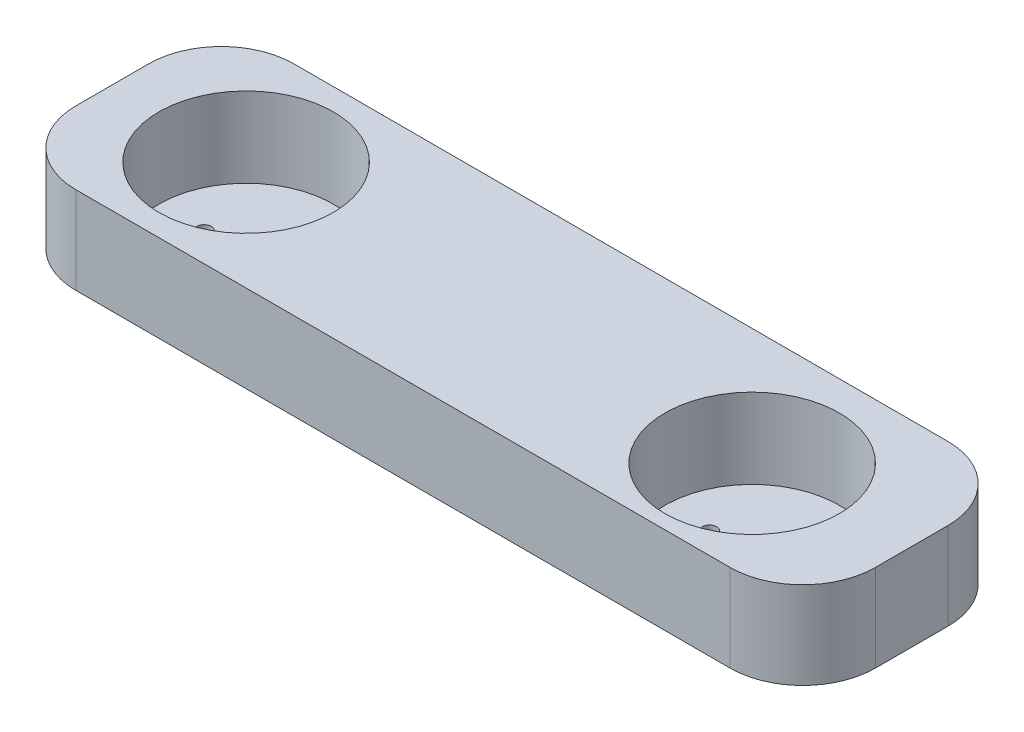
ISO-10303-21;
HEADER;
FILE_DESCRIPTION(('STEP AP214'),'2;1');
FILE_NAME('part.step','',(''),(''),'','','');
FILE_SCHEMA(('AUTOMOTIVE_DESIGN { 1 0 10303 214 1 1 1 1 }'));
ENDSEC;
DATA;
#1=APPLICATION_CONTEXT('core data for automotive mechanical design processes');
#2=APPLICATION_PROTOCOL_DEFINITION('international standard','automotive_design',2000,#1);
#3=PRODUCT_CONTEXT('',#1,'mechanical');
#4=PRODUCT('Part','Part','',(#3));
#5=PRODUCT_RELATED_PRODUCT_CATEGORY('part','',(#4));
#6=PRODUCT_DEFINITION_FORMATION('','',#4);
#7=PRODUCT_DEFINITION_CONTEXT('part definition',#1,'design');
#8=PRODUCT_DEFINITION('design','',#6,#7);
#9=PRODUCT_DEFINITION_SHAPE('','',#8);
#10=(LENGTH_UNIT() NAMED_UNIT(*) SI_UNIT(.MILLI.,.METRE.));
#11=(NAMED_UNIT(*) PLANE_ANGLE_UNIT() SI_UNIT($,.RADIAN.));
#12=(NAMED_UNIT(*) SI_UNIT($,.STERADIAN.) SOLID_ANGLE_UNIT());
#13=UNCERTAINTY_MEASURE_WITH_UNIT(LENGTH_MEASURE(1.E-05),#10,'distance_accuracy_value','');
#14=(GEOMETRIC_REPRESENTATION_CONTEXT(3) GLOBAL_UNCERTAINTY_ASSIGNED_CONTEXT((#13)) GLOBAL_UNIT_ASSIGNED_CONTEXT((#10,
#11,#12)) REPRESENTATION_CONTEXT('',''));
#15=CARTESIAN_POINT('',(0.,0.,0.));
#16=DIRECTION('',(0.,0.,1.));
#17=DIRECTION('',(1.,0.,0.));
#18=AXIS2_PLACEMENT_3D('',#15,#16,#17);
#19=CARTESIAN_POINT('',(-49.6145692439427,12.,-18.5383745295534));
#20=DIRECTION('',(1.,0.,0.));
#21=DIRECTION('',(0.,0.,-1.));
#22=AXIS2_PLACEMENT_3D('',#19,#20,#21);
#23=PLANE('',#22);
#24=DIRECTION('',(0.,0.,1.));
#25=VECTOR('',#24,1.);
#26=CARTESIAN_POINT('',(-49.6145692439427,12.,-18.5383745295534));
#27=LINE('',#26,#25);
#28=CARTESIAN_POINT('',(-49.6145692439427,12.,-8.53837452955342));
#29=VERTEX_POINT('',#28);
#30=CARTESIAN_POINT('',(-49.6145692439427,12.,1.46162547044658));
#31=VERTEX_POINT('',#30);
#32=EDGE_CURVE('E119',#29,#31,#27,.T.);
#33=ORIENTED_EDGE('',*,*,#32,.F.);
#34=DIRECTION('',(0.,-1.,0.));
#35=VECTOR('',#34,1.);
#36=CARTESIAN_POINT('',(-49.6145692439427,12.,-8.53837452955342));
#37=LINE('',#36,#35);
#38=CARTESIAN_POINT('',(-49.6145692439427,0.,-8.53837452955342));
#39=VERTEX_POINT('',#38);
#40=EDGE_CURVE('E105',#29,#39,#37,.T.);
#41=ORIENTED_EDGE('',*,*,#40,.T.);
#42=DIRECTION('',(0.,0.,1.));
#43=VECTOR('',#42,1.);
#44=CARTESIAN_POINT('',(-49.6145692439427,0.,-18.5383745295534));
#45=LINE('',#44,#43);
#46=CARTESIAN_POINT('',(-49.6145692439427,0.,1.46162547044658));
#47=VERTEX_POINT('',#46);
#48=EDGE_CURVE('E116',#39,#47,#45,.T.);
#49=ORIENTED_EDGE('',*,*,#48,.T.);
#50=DIRECTION('',(0.,-1.,0.));
#51=VECTOR('',#50,1.);
#52=CARTESIAN_POINT('',(-49.6145692439427,12.,1.46162547044658));
#53=LINE('',#52,#51);
#54=EDGE_CURVE('E120',#47,#31,#53,.F.);
#55=ORIENTED_EDGE('',*,*,#54,.T.);
#56=EDGE_LOOP('',(#33,#41,#49,#55));
#57=FACE_BOUND('',#56,.T.);
#58=ADVANCED_FACE('F33',(#57),#23,.F.);
#59=CARTESIAN_POINT('',(-49.6145692439427,12.,11.4616254704466));
#60=DIRECTION('',(0.,0.,-1.));
#61=DIRECTION('',(-1.,0.,0.));
#62=AXIS2_PLACEMENT_3D('',#59,#60,#61);
#63=PLANE('',#62);
#64=DIRECTION('',(1.,0.,0.));
#65=VECTOR('',#64,1.);
#66=CARTESIAN_POINT('',(-49.6145692439427,0.,11.4616254704466));
#67=LINE('',#66,#65);
#68=CARTESIAN_POINT('',(-39.6145692439427,0.,11.4616254704466));
#69=VERTEX_POINT('',#68);
#70=CARTESIAN_POINT('',(50.3854307560573,0.,11.4616254704466));
#71=VERTEX_POINT('',#70);
#72=EDGE_CURVE('E124',#69,#71,#67,.T.);
#73=ORIENTED_EDGE('',*,*,#72,.T.);
#74=DIRECTION('',(0.,-1.,0.));
#75=VECTOR('',#74,1.);
#76=CARTESIAN_POINT('',(50.3854307560573,12.,11.4616254704466));
#77=LINE('',#76,#75);
#78=CARTESIAN_POINT('',(50.3854307560573,12.,11.4616254704466));
#79=VERTEX_POINT('',#78);
#80=EDGE_CURVE('E11',#71,#79,#77,.F.);
#81=ORIENTED_EDGE('',*,*,#80,.T.);
#82=DIRECTION('',(1.,0.,0.));
#83=VECTOR('',#82,1.);
#84=CARTESIAN_POINT('',(-49.6145692439427,12.,11.4616254704466));
#85=LINE('',#84,#83);
#86=CARTESIAN_POINT('',(-39.6145692439427,12.,11.4616254704466));
#87=VERTEX_POINT('',#86);
#88=EDGE_CURVE('E178',#87,#79,#85,.T.);
#89=ORIENTED_EDGE('',*,*,#88,.F.);
#90=DIRECTION('',(0.,-1.,0.));
#91=VECTOR('',#90,1.);
#92=CARTESIAN_POINT('',(-39.6145692439427,12.,11.4616254704466));
#93=LINE('',#92,#91);
#94=EDGE_CURVE('E146',#87,#69,#93,.T.);
#95=ORIENTED_EDGE('',*,*,#94,.T.);
#96=EDGE_LOOP('',(#73,#81,#89,#95));
#97=FACE_BOUND('',#96,.T.);
#98=ADVANCED_FACE('F176',(#97),#63,.F.);
#99=CARTESIAN_POINT('',(60.3854307560573,12.,-18.5383745295534));
#100=DIRECTION('',(-1.,0.,0.));
#101=DIRECTION('',(0.,0.,1.));
#102=AXIS2_PLACEMENT_3D('',#99,#100,#101);
#103=PLANE('',#102);
#104=DIRECTION('',(0.,0.,-1.));
#105=VECTOR('',#104,1.);
#106=CARTESIAN_POINT('',(60.3854307560573,0.,-18.5383745295534));
#107=LINE('',#106,#105);
#108=CARTESIAN_POINT('',(60.3854307560573,0.,1.46162547044659));
#109=VERTEX_POINT('',#108);
#110=CARTESIAN_POINT('',(60.3854307560573,0.,-8.53837452955341));
#111=VERTEX_POINT('',#110);
#112=EDGE_CURVE('E127',#109,#111,#107,.T.);
#113=ORIENTED_EDGE('',*,*,#112,.T.);
#114=DIRECTION('',(0.,-1.,0.));
#115=VECTOR('',#114,1.);
#116=CARTESIAN_POINT('',(60.3854307560573,12.,-8.53837452955341));
#117=LINE('',#116,#115);
#118=CARTESIAN_POINT('',(60.3854307560573,12.,-8.53837452955341));
#119=VERTEX_POINT('',#118);
#120=EDGE_CURVE('E54',#111,#119,#117,.F.);
#121=ORIENTED_EDGE('',*,*,#120,.T.);
#122=DIRECTION('',(0.,0.,-1.));
#123=VECTOR('',#122,1.);
#124=CARTESIAN_POINT('',(60.3854307560573,12.,-18.5383745295534));
#125=LINE('',#124,#123);
#126=CARTESIAN_POINT('',(60.3854307560573,12.,1.46162547044659));
#127=VERTEX_POINT('',#126);
#128=EDGE_CURVE('E165',#127,#119,#125,.T.);
#129=ORIENTED_EDGE('',*,*,#128,.F.);
#130=DIRECTION('',(0.,-1.,0.));
#131=VECTOR('',#130,1.);
#132=CARTESIAN_POINT('',(60.3854307560573,12.,1.46162547044659));
#133=LINE('',#132,#131);
#134=EDGE_CURVE('E156',#127,#109,#133,.T.);
#135=ORIENTED_EDGE('',*,*,#134,.T.);
#136=EDGE_LOOP('',(#113,#121,#129,#135));
#137=FACE_BOUND('',#136,.T.);
#138=ADVANCED_FACE('F172',(#137),#103,.F.);
#139=CARTESIAN_POINT('',(-49.6145692439427,12.,-18.5383745295534));
#140=DIRECTION('',(0.,0.,1.));
#141=DIRECTION('',(1.,0.,0.));
#142=AXIS2_PLACEMENT_3D('',#139,#140,#141);
#143=PLANE('',#142);
#144=DIRECTION('',(-1.,0.,0.));
#145=VECTOR('',#144,1.);
#146=CARTESIAN_POINT('',(-49.6145692439427,12.,-18.5383745295534));
#147=LINE('',#146,#145);
#148=CARTESIAN_POINT('',(50.3854307560573,12.,-18.5383745295534));
#149=VERTEX_POINT('',#148);
#150=CARTESIAN_POINT('',(-39.6145692439427,12.,-18.5383745295534));
#151=VERTEX_POINT('',#150);
#152=EDGE_CURVE('E133',#149,#151,#147,.T.);
#153=ORIENTED_EDGE('',*,*,#152,.F.);
#154=DIRECTION('',(0.,-1.,0.));
#155=VECTOR('',#154,1.);
#156=CARTESIAN_POINT('',(50.3854307560573,12.,-18.5383745295534));
#157=LINE('',#156,#155);
#158=CARTESIAN_POINT('',(50.3854307560573,0.,-18.5383745295534));
#159=VERTEX_POINT('',#158);
#160=EDGE_CURVE('E149',#149,#159,#157,.T.);
#161=ORIENTED_EDGE('',*,*,#160,.T.);
#162=DIRECTION('',(-1.,0.,0.));
#163=VECTOR('',#162,1.);
#164=CARTESIAN_POINT('',(-49.6145692439427,0.,-18.5383745295534));
#165=LINE('',#164,#163);
#166=CARTESIAN_POINT('',(-39.6145692439427,0.,-18.5383745295534));
#167=VERTEX_POINT('',#166);
#168=EDGE_CURVE('E137',#159,#167,#165,.T.);
#169=ORIENTED_EDGE('',*,*,#168,.T.);
#170=DIRECTION('',(0.,-1.,0.));
#171=VECTOR('',#170,1.);
#172=CARTESIAN_POINT('',(-39.6145692439427,12.,-18.5383745295534));
#173=LINE('',#172,#171);
#174=EDGE_CURVE('E107',#167,#151,#173,.F.);
#175=ORIENTED_EDGE('',*,*,#174,.T.);
#176=EDGE_LOOP('',(#153,#161,#169,#175));
#177=FACE_BOUND('',#176,.T.);
#178=ADVANCED_FACE('F169',(#177),#143,.F.);
#179=CARTESIAN_POINT('',(0.,12.,0.));
#180=DIRECTION('',(0.,1.,0.));
#181=DIRECTION('',(0.,0.,1.));
#182=AXIS2_PLACEMENT_3D('',#179,#180,#181);
#183=PLANE('',#182);
#184=CARTESIAN_POINT('',(39.5010706753496,12.,-2.46616460756854));
#185=DIRECTION('',(0.,1.,0.));
#186=DIRECTION('',(0.,0.,1.));
#187=AXIS2_PLACEMENT_3D('',#184,#185,#186);
#188=CIRCLE('',#187,12.);
#189=CARTESIAN_POINT('',(39.5010706753496,12.,9.53383539243146));
#190=VERTEX_POINT('',#189);
#191=EDGE_CURVE('E188',#190,#190,#188,.T.);
#192=ORIENTED_EDGE('',*,*,#191,.F.);
#193=EDGE_LOOP('',(#192));
#194=FACE_BOUND('',#193,.T.);
#195=CARTESIAN_POINT('',(-31.1957624230947,12.,-3.53837452955342));
#196=DIRECTION('',(0.,1.,0.));
#197=DIRECTION('',(0.,0.,1.));
#198=AXIS2_PLACEMENT_3D('',#195,#196,#197);
#199=CIRCLE('',#198,12.);
#200=CARTESIAN_POINT('',(-31.1957624230947,12.,8.46162547044659));
#201=VERTEX_POINT('',#200);
#202=EDGE_CURVE('E130',#201,#201,#199,.T.);
#203=ORIENTED_EDGE('',*,*,#202,.F.);
#204=EDGE_LOOP('',(#203));
#205=FACE_BOUND('',#204,.T.);
#206=ORIENTED_EDGE('',*,*,#128,.T.);
#207=CARTESIAN_POINT('',(50.3854307560573,12.,-8.53837452955342));
#208=DIRECTION('',(0.,1.,0.));
#209=DIRECTION('',(0.,0.,1.));
#210=AXIS2_PLACEMENT_3D('',#207,#208,#209);
#211=CIRCLE('',#210,10.);
#212=EDGE_CURVE('E41',#119,#149,#211,.T.);
#213=ORIENTED_EDGE('',*,*,#212,.T.);
#214=ORIENTED_EDGE('',*,*,#152,.T.);
#215=CARTESIAN_POINT('',(-39.6145692439427,12.,-8.53837452955342));
#216=DIRECTION('',(0.,1.,0.));
#217=DIRECTION('',(0.,0.,1.));
#218=AXIS2_PLACEMENT_3D('',#215,#216,#217);
#219=CIRCLE('',#218,10.);
#220=EDGE_CURVE('E144',#151,#29,#219,.T.);
#221=ORIENTED_EDGE('',*,*,#220,.T.);
#222=ORIENTED_EDGE('',*,*,#32,.T.);
#223=CARTESIAN_POINT('',(-39.6145692439427,12.,1.46162547044658));
#224=DIRECTION('',(0.,1.,0.));
#225=DIRECTION('',(0.,0.,1.));
#226=AXIS2_PLACEMENT_3D('',#223,#224,#225);
#227=CIRCLE('',#226,10.);
#228=EDGE_CURVE('E142',#31,#87,#227,.T.);
#229=ORIENTED_EDGE('',*,*,#228,.T.);
#230=ORIENTED_EDGE('',*,*,#88,.T.);
#231=CARTESIAN_POINT('',(50.3854307560573,12.,1.46162547044659));
#232=DIRECTION('',(0.,1.,0.));
#233=DIRECTION('',(0.,0.,1.));
#234=AXIS2_PLACEMENT_3D('',#231,#232,#233);
#235=CIRCLE('',#234,10.);
#236=EDGE_CURVE('E160',#79,#127,#235,.T.);
#237=ORIENTED_EDGE('',*,*,#236,.T.);
#238=EDGE_LOOP('',(#206,#213,#214,#221,#222,#229,#230,#237));
#239=FACE_BOUND('',#238,.T.);
#240=ADVANCED_FACE('F164',(#194,#205,#239),#183,.T.);
#241=CARTESIAN_POINT('',(0.,0.,0.));
#242=DIRECTION('',(0.,1.,0.));
#243=DIRECTION('',(0.,0.,1.));
#244=AXIS2_PLACEMENT_3D('',#241,#242,#243);
#245=PLANE('',#244);
#246=CARTESIAN_POINT('',(-36.9327614376234,0.,-3.48451722341676));
#247=DIRECTION('',(0.,1.,0.));
#248=DIRECTION('',(0.,0.,-1.));
#249=AXIS2_PLACEMENT_3D('',#246,#247,#248);
#250=CIRCLE('',#249,0.999999999999998);
#251=CARTESIAN_POINT('',(-36.9327614376234,0.,-4.48451722341675));
#252=VERTEX_POINT('',#251);
#253=EDGE_CURVE('E221',#252,#252,#250,.T.);
#254=ORIENTED_EDGE('',*,*,#253,.T.);
#255=EDGE_LOOP('',(#254));
#256=FACE_BOUND('',#255,.T.);
#257=CARTESIAN_POINT('',(-25.0727614376234,0.,-3.48451722341676));
#258=DIRECTION('',(0.,1.,0.));
#259=DIRECTION('',(0.,0.,1.));
#260=AXIS2_PLACEMENT_3D('',#257,#258,#259);
#261=CIRCLE('',#260,0.999999999999998);
#262=CARTESIAN_POINT('',(-25.0727614376234,0.,-2.48451722341676));
#263=VERTEX_POINT('',#262);
#264=EDGE_CURVE('E215',#263,#263,#261,.T.);
#265=ORIENTED_EDGE('',*,*,#264,.T.);
#266=EDGE_LOOP('',(#265));
#267=FACE_BOUND('',#266,.T.);
#268=CARTESIAN_POINT('',(-31.0027614376234,0.,-3.48451722341676));
#269=DIRECTION('',(0.,1.,0.));
#270=DIRECTION('',(0.,0.,1.));
#271=AXIS2_PLACEMENT_3D('',#268,#269,#270);
#272=CIRCLE('',#271,3.43);
#273=CARTESIAN_POINT('',(-31.0027614376234,0.,-0.0545172234167543));
#274=VERTEX_POINT('',#273);
#275=EDGE_CURVE('E204',#274,#274,#272,.T.);
#276=ORIENTED_EDGE('',*,*,#275,.T.);
#277=EDGE_LOOP('',(#276));
#278=FACE_BOUND('',#277,.T.);
#279=CARTESIAN_POINT('',(33.619161616832,0.,-2.46616460756854));
#280=DIRECTION('',(0.,1.,0.));
#281=DIRECTION('',(0.,0.,-1.));
#282=AXIS2_PLACEMENT_3D('',#279,#280,#281);
#283=CIRCLE('',#282,0.999999999999998);
#284=CARTESIAN_POINT('',(33.619161616832,0.,-3.46616460756854));
#285=VERTEX_POINT('',#284);
#286=EDGE_CURVE('E203',#285,#285,#283,.T.);
#287=ORIENTED_EDGE('',*,*,#286,.T.);
#288=EDGE_LOOP('',(#287));
#289=FACE_BOUND('',#288,.T.);
#290=CARTESIAN_POINT('',(45.479161616832,0.,-2.46616460756854));
#291=DIRECTION('',(0.,1.,0.));
#292=DIRECTION('',(0.,0.,1.));
#293=AXIS2_PLACEMENT_3D('',#290,#291,#292);
#294=CIRCLE('',#293,0.999999999999998);
#295=CARTESIAN_POINT('',(45.479161616832,0.,-1.46616460756854));
#296=VERTEX_POINT('',#295);
#297=EDGE_CURVE('E197',#296,#296,#294,.T.);
#298=ORIENTED_EDGE('',*,*,#297,.T.);
#299=EDGE_LOOP('',(#298));
#300=FACE_BOUND('',#299,.T.);
#301=CARTESIAN_POINT('',(39.549161616832,0.,-2.46616460756854));
#302=DIRECTION('',(0.,1.,0.));
#303=DIRECTION('',(0.,0.,1.));
#304=AXIS2_PLACEMENT_3D('',#301,#302,#303);
#305=CIRCLE('',#304,3.43);
#306=CARTESIAN_POINT('',(39.549161616832,0.,0.963835392431464));
#307=VERTEX_POINT('',#306);
#308=EDGE_CURVE('E191',#307,#307,#305,.T.);
#309=ORIENTED_EDGE('',*,*,#308,.T.);
#310=EDGE_LOOP('',(#309));
#311=FACE_BOUND('',#310,.T.);
#312=ORIENTED_EDGE('',*,*,#168,.F.);
#313=CARTESIAN_POINT('',(50.3854307560573,0.,-8.53837452955342));
#314=DIRECTION('',(0.,1.,0.));
#315=DIRECTION('',(0.,0.,1.));
#316=AXIS2_PLACEMENT_3D('',#313,#314,#315);
#317=CIRCLE('',#316,10.);
#318=EDGE_CURVE('E154',#159,#111,#317,.F.);
#319=ORIENTED_EDGE('',*,*,#318,.T.);
#320=ORIENTED_EDGE('',*,*,#112,.F.);
#321=CARTESIAN_POINT('',(50.3854307560573,0.,1.46162547044659));
#322=DIRECTION('',(0.,1.,0.));
#323=DIRECTION('',(0.,0.,1.));
#324=AXIS2_PLACEMENT_3D('',#321,#322,#323);
#325=CIRCLE('',#324,10.);
#326=EDGE_CURVE('E152',#109,#71,#325,.F.);
#327=ORIENTED_EDGE('',*,*,#326,.T.);
#328=ORIENTED_EDGE('',*,*,#72,.F.);
#329=CARTESIAN_POINT('',(-39.6145692439427,0.,1.46162547044658));
#330=DIRECTION('',(0.,1.,0.));
#331=DIRECTION('',(0.,0.,1.));
#332=AXIS2_PLACEMENT_3D('',#329,#330,#331);
#333=CIRCLE('',#332,10.);
#334=EDGE_CURVE('E111',#69,#47,#333,.F.);
#335=ORIENTED_EDGE('',*,*,#334,.T.);
#336=ORIENTED_EDGE('',*,*,#48,.F.);
#337=CARTESIAN_POINT('',(-39.6145692439427,0.,-8.53837452955342));
#338=DIRECTION('',(0.,1.,0.));
#339=DIRECTION('',(0.,0.,1.));
#340=AXIS2_PLACEMENT_3D('',#337,#338,#339);
#341=CIRCLE('',#340,10.);
#342=EDGE_CURVE('E101',#39,#167,#341,.F.);
#343=ORIENTED_EDGE('',*,*,#342,.T.);
#344=EDGE_LOOP('',(#312,#319,#320,#327,#328,#335,#336,#343));
#345=FACE_BOUND('',#344,.T.);
#346=ADVANCED_FACE('F122',(#256,#267,#278,#289,#300,#311,#345),#245,.F.);
#347=CARTESIAN_POINT('',(-39.6145692439427,12.,-8.53837452955342));
#348=DIRECTION('',(0.,-1.,0.));
#349=DIRECTION('',(0.,0.,-1.));
#350=AXIS2_PLACEMENT_3D('',#347,#348,#349);
#351=CYLINDRICAL_SURFACE('',#350,10.);
#352=ORIENTED_EDGE('',*,*,#220,.F.);
#353=ORIENTED_EDGE('',*,*,#174,.F.);
#354=ORIENTED_EDGE('',*,*,#342,.F.);
#355=ORIENTED_EDGE('',*,*,#40,.F.);
#356=EDGE_LOOP('',(#352,#353,#354,#355));
#357=FACE_BOUND('',#356,.T.);
#358=ADVANCED_FACE('F104',(#357),#351,.T.);
#359=CARTESIAN_POINT('',(-39.6145692439427,12.,1.46162547044658));
#360=DIRECTION('',(0.,-1.,0.));
#361=DIRECTION('',(0.,0.,-1.));
#362=AXIS2_PLACEMENT_3D('',#359,#360,#361);
#363=CYLINDRICAL_SURFACE('',#362,10.);
#364=ORIENTED_EDGE('',*,*,#228,.F.);
#365=ORIENTED_EDGE('',*,*,#54,.F.);
#366=ORIENTED_EDGE('',*,*,#334,.F.);
#367=ORIENTED_EDGE('',*,*,#94,.F.);
#368=EDGE_LOOP('',(#364,#365,#366,#367));
#369=FACE_BOUND('',#368,.T.);
#370=ADVANCED_FACE('F181',(#369),#363,.T.);
#371=CARTESIAN_POINT('',(50.3854307560573,12.,-8.53837452955342));
#372=DIRECTION('',(0.,-1.,0.));
#373=DIRECTION('',(0.,0.,-1.));
#374=AXIS2_PLACEMENT_3D('',#371,#372,#373);
#375=CYLINDRICAL_SURFACE('',#374,10.);
#376=ORIENTED_EDGE('',*,*,#212,.F.);
#377=ORIENTED_EDGE('',*,*,#120,.F.);
#378=ORIENTED_EDGE('',*,*,#318,.F.);
#379=ORIENTED_EDGE('',*,*,#160,.F.);
#380=EDGE_LOOP('',(#376,#377,#378,#379));
#381=FACE_BOUND('',#380,.T.);
#382=ADVANCED_FACE('F170',(#381),#375,.T.);
#383=CARTESIAN_POINT('',(50.3854307560573,12.,1.46162547044659));
#384=DIRECTION('',(0.,-1.,0.));
#385=DIRECTION('',(0.,0.,-1.));
#386=AXIS2_PLACEMENT_3D('',#383,#384,#385);
#387=CYLINDRICAL_SURFACE('',#386,10.);
#388=ORIENTED_EDGE('',*,*,#236,.F.);
#389=ORIENTED_EDGE('',*,*,#80,.F.);
#390=ORIENTED_EDGE('',*,*,#326,.F.);
#391=ORIENTED_EDGE('',*,*,#134,.F.);
#392=EDGE_LOOP('',(#388,#389,#390,#391));
#393=FACE_BOUND('',#392,.T.);
#394=ADVANCED_FACE('F35',(#393),#387,.T.);
#395=CARTESIAN_POINT('',(-31.1957624230947,1.,-3.53837452955342));
#396=DIRECTION('',(0.,1.,0.));
#397=DIRECTION('',(0.,0.,1.));
#398=AXIS2_PLACEMENT_3D('',#395,#396,#397);
#399=CYLINDRICAL_SURFACE('',#398,12.);
#400=CARTESIAN_POINT('',(-31.1957624230947,1.,-3.53837452955342));
#401=DIRECTION('',(0.,1.,0.));
#402=DIRECTION('',(0.,0.,1.));
#403=AXIS2_PLACEMENT_3D('',#400,#401,#402);
#404=CIRCLE('',#403,12.);
#405=CARTESIAN_POINT('',(-31.1957624230947,1.,8.46162547044659));
#406=VERTEX_POINT('',#405);
#407=EDGE_CURVE('E125',#406,#406,#404,.T.);
#408=ORIENTED_EDGE('',*,*,#407,.F.);
#409=EDGE_LOOP('',(#408));
#410=FACE_BOUND('',#409,.T.);
#411=ORIENTED_EDGE('',*,*,#202,.T.);
#412=EDGE_LOOP('',(#411));
#413=FACE_BOUND('',#412,.T.);
#414=ADVANCED_FACE('F244',(#410,#413),#399,.F.);
#415=CARTESIAN_POINT('',(-31.1957624230947,1.,-3.53837452955342));
#416=DIRECTION('',(0.,1.,0.));
#417=DIRECTION('',(0.,0.,1.));
#418=AXIS2_PLACEMENT_3D('',#415,#416,#417);
#419=PLANE('',#418);
#420=CARTESIAN_POINT('',(-31.0027614376234,1.,-3.48451722341676));
#421=DIRECTION('',(0.,1.,0.));
#422=DIRECTION('',(0.,0.,1.));
#423=AXIS2_PLACEMENT_3D('',#420,#421,#422);
#424=CIRCLE('',#423,3.43);
#425=CARTESIAN_POINT('',(-31.0027614376234,1.,-0.0545172234167543));
#426=VERTEX_POINT('',#425);
#427=EDGE_CURVE('E212',#426,#426,#424,.T.);
#428=ORIENTED_EDGE('',*,*,#427,.F.);
#429=EDGE_LOOP('',(#428));
#430=FACE_BOUND('',#429,.T.);
#431=CARTESIAN_POINT('',(-36.9327614376234,1.,-3.48451722341676));
#432=DIRECTION('',(0.,1.,0.));
#433=DIRECTION('',(0.,0.,-1.));
#434=AXIS2_PLACEMENT_3D('',#431,#432,#433);
#435=CIRCLE('',#434,0.999999999999998);
#436=CARTESIAN_POINT('',(-36.9327614376234,1.,-4.48451722341675));
#437=VERTEX_POINT('',#436);
#438=EDGE_CURVE('E218',#437,#437,#435,.T.);
#439=ORIENTED_EDGE('',*,*,#438,.F.);
#440=EDGE_LOOP('',(#439));
#441=FACE_BOUND('',#440,.T.);
#442=CARTESIAN_POINT('',(-25.0727614376234,1.,-3.48451722341676));
#443=DIRECTION('',(0.,1.,0.));
#444=DIRECTION('',(0.,0.,1.));
#445=AXIS2_PLACEMENT_3D('',#442,#443,#444);
#446=CIRCLE('',#445,0.999999999999998);
#447=CARTESIAN_POINT('',(-25.0727614376234,1.,-2.48451722341676));
#448=VERTEX_POINT('',#447);
#449=EDGE_CURVE('E224',#448,#448,#446,.T.);
#450=ORIENTED_EDGE('',*,*,#449,.F.);
#451=EDGE_LOOP('',(#450));
#452=FACE_BOUND('',#451,.T.);
#453=ORIENTED_EDGE('',*,*,#407,.T.);
#454=EDGE_LOOP('',(#453));
#455=FACE_BOUND('',#454,.T.);
#456=ADVANCED_FACE('F240',(#430,#441,#452,#455),#419,.T.);
#457=CARTESIAN_POINT('',(39.5010706753496,1.,-2.46616460756854));
#458=DIRECTION('',(0.,1.,0.));
#459=DIRECTION('',(0.,0.,1.));
#460=AXIS2_PLACEMENT_3D('',#457,#458,#459);
#461=CYLINDRICAL_SURFACE('',#460,12.);
#462=CARTESIAN_POINT('',(39.5010706753496,1.,-2.46616460756854));
#463=DIRECTION('',(0.,1.,0.));
#464=DIRECTION('',(0.,0.,1.));
#465=AXIS2_PLACEMENT_3D('',#462,#463,#464);
#466=CIRCLE('',#465,12.);
#467=CARTESIAN_POINT('',(39.5010706753496,1.,9.53383539243146));
#468=VERTEX_POINT('',#467);
#469=EDGE_CURVE('E186',#468,#468,#466,.T.);
#470=ORIENTED_EDGE('',*,*,#469,.F.);
#471=EDGE_LOOP('',(#470));
#472=FACE_BOUND('',#471,.T.);
#473=ORIENTED_EDGE('',*,*,#191,.T.);
#474=EDGE_LOOP('',(#473));
#475=FACE_BOUND('',#474,.T.);
#476=ADVANCED_FACE('F243',(#472,#475),#461,.F.);
#477=CARTESIAN_POINT('',(39.5010706753496,1.,-2.46616460756854));
#478=DIRECTION('',(0.,1.,0.));
#479=DIRECTION('',(0.,0.,1.));
#480=AXIS2_PLACEMENT_3D('',#477,#478,#479);
#481=PLANE('',#480);
#482=CARTESIAN_POINT('',(39.549161616832,1.,-2.46616460756854));
#483=DIRECTION('',(0.,1.,0.));
#484=DIRECTION('',(0.,0.,1.));
#485=AXIS2_PLACEMENT_3D('',#482,#483,#484);
#486=CIRCLE('',#485,3.43);
#487=CARTESIAN_POINT('',(39.549161616832,1.,0.963835392431464));
#488=VERTEX_POINT('',#487);
#489=EDGE_CURVE('E194',#488,#488,#486,.T.);
#490=ORIENTED_EDGE('',*,*,#489,.F.);
#491=EDGE_LOOP('',(#490));
#492=FACE_BOUND('',#491,.T.);
#493=CARTESIAN_POINT('',(33.619161616832,1.,-2.46616460756854));
#494=DIRECTION('',(0.,1.,0.));
#495=DIRECTION('',(0.,0.,-1.));
#496=AXIS2_PLACEMENT_3D('',#493,#494,#495);
#497=CIRCLE('',#496,0.999999999999998);
#498=CARTESIAN_POINT('',(33.619161616832,1.,-3.46616460756854));
#499=VERTEX_POINT('',#498);
#500=EDGE_CURVE('E200',#499,#499,#497,.T.);
#501=ORIENTED_EDGE('',*,*,#500,.F.);
#502=EDGE_LOOP('',(#501));
#503=FACE_BOUND('',#502,.T.);
#504=CARTESIAN_POINT('',(45.479161616832,1.,-2.46616460756854));
#505=DIRECTION('',(0.,1.,0.));
#506=DIRECTION('',(0.,0.,1.));
#507=AXIS2_PLACEMENT_3D('',#504,#505,#506);
#508=CIRCLE('',#507,0.999999999999998);
#509=CARTESIAN_POINT('',(45.479161616832,1.,-1.46616460756854));
#510=VERTEX_POINT('',#509);
#511=EDGE_CURVE('E207',#510,#510,#508,.T.);
#512=ORIENTED_EDGE('',*,*,#511,.F.);
#513=EDGE_LOOP('',(#512));
#514=FACE_BOUND('',#513,.T.);
#515=ORIENTED_EDGE('',*,*,#469,.T.);
#516=EDGE_LOOP('',(#515));
#517=FACE_BOUND('',#516,.T.);
#518=ADVANCED_FACE('F298',(#492,#503,#514,#517),#481,.T.);
#519=CARTESIAN_POINT('',(45.479161616832,0.,-2.46616460756854));
#520=DIRECTION('',(0.,1.,0.));
#521=DIRECTION('',(0.,0.,1.));
#522=AXIS2_PLACEMENT_3D('',#519,#520,#521);
#523=CYLINDRICAL_SURFACE('',#522,0.999999999999998);
#524=ORIENTED_EDGE('',*,*,#297,.F.);
#525=EDGE_LOOP('',(#524));
#526=FACE_BOUND('',#525,.T.);
#527=ORIENTED_EDGE('',*,*,#511,.T.);
#528=EDGE_LOOP('',(#527));
#529=FACE_BOUND('',#528,.T.);
#530=ADVANCED_FACE('F306',(#526,#529),#523,.F.);
#531=CARTESIAN_POINT('',(33.619161616832,0.,-2.46616460756854));
#532=DIRECTION('',(0.,1.,0.));
#533=DIRECTION('',(0.,0.,1.));
#534=AXIS2_PLACEMENT_3D('',#531,#532,#533);
#535=CYLINDRICAL_SURFACE('',#534,0.999999999999998);
#536=ORIENTED_EDGE('',*,*,#286,.F.);
#537=EDGE_LOOP('',(#536));
#538=FACE_BOUND('',#537,.T.);
#539=ORIENTED_EDGE('',*,*,#500,.T.);
#540=EDGE_LOOP('',(#539));
#541=FACE_BOUND('',#540,.T.);
#542=ADVANCED_FACE('F314',(#538,#541),#535,.F.);
#543=CARTESIAN_POINT('',(39.549161616832,0.,-2.46616460756854));
#544=DIRECTION('',(0.,1.,0.));
#545=DIRECTION('',(0.,0.,1.));
#546=AXIS2_PLACEMENT_3D('',#543,#544,#545);
#547=CYLINDRICAL_SURFACE('',#546,3.43);
#548=ORIENTED_EDGE('',*,*,#308,.F.);
#549=EDGE_LOOP('',(#548));
#550=FACE_BOUND('',#549,.T.);
#551=ORIENTED_EDGE('',*,*,#489,.T.);
#552=EDGE_LOOP('',(#551));
#553=FACE_BOUND('',#552,.T.);
#554=ADVANCED_FACE('F236',(#550,#553),#547,.F.);
#555=CARTESIAN_POINT('',(-25.0727614376234,0.,-3.48451722341676));
#556=DIRECTION('',(0.,1.,0.));
#557=DIRECTION('',(0.,0.,1.));
#558=AXIS2_PLACEMENT_3D('',#555,#556,#557);
#559=CYLINDRICAL_SURFACE('',#558,0.999999999999998);
#560=ORIENTED_EDGE('',*,*,#264,.F.);
#561=EDGE_LOOP('',(#560));
#562=FACE_BOUND('',#561,.T.);
#563=ORIENTED_EDGE('',*,*,#449,.T.);
#564=EDGE_LOOP('',(#563));
#565=FACE_BOUND('',#564,.T.);
#566=ADVANCED_FACE('F232',(#562,#565),#559,.F.);
#567=CARTESIAN_POINT('',(-36.9327614376234,0.,-3.48451722341676));
#568=DIRECTION('',(0.,1.,0.));
#569=DIRECTION('',(0.,0.,1.));
#570=AXIS2_PLACEMENT_3D('',#567,#568,#569);
#571=CYLINDRICAL_SURFACE('',#570,0.999999999999998);
#572=ORIENTED_EDGE('',*,*,#253,.F.);
#573=EDGE_LOOP('',(#572));
#574=FACE_BOUND('',#573,.T.);
#575=ORIENTED_EDGE('',*,*,#438,.T.);
#576=EDGE_LOOP('',(#575));
#577=FACE_BOUND('',#576,.T.);
#578=ADVANCED_FACE('F235',(#574,#577),#571,.F.);
#579=CARTESIAN_POINT('',(-31.0027614376234,0.,-3.48451722341676));
#580=DIRECTION('',(0.,1.,0.));
#581=DIRECTION('',(0.,0.,1.));
#582=AXIS2_PLACEMENT_3D('',#579,#580,#581);
#583=CYLINDRICAL_SURFACE('',#582,3.43);
#584=ORIENTED_EDGE('',*,*,#275,.F.);
#585=EDGE_LOOP('',(#584));
#586=FACE_BOUND('',#585,.T.);
#587=ORIENTED_EDGE('',*,*,#427,.T.);
#588=EDGE_LOOP('',(#587));
#589=FACE_BOUND('',#588,.T.);
#590=ADVANCED_FACE('F339',(#586,#589),#583,.F.);
#591=CLOSED_SHELL('',(#58,#98,#138,#178,#240,#346,#358,#370,#382,#394,#414,#456,#476,#518,#530,
#542,#554,#566,#578,#590));
#592=MANIFOLD_SOLID_BREP('B2',#591);
#593=ADVANCED_BREP_SHAPE_REPRESENTATION('',(#18,#592),#14);
#594=SHAPE_DEFINITION_REPRESENTATION(#9,#593);
ENDSEC;
END-ISO-10303-21;
